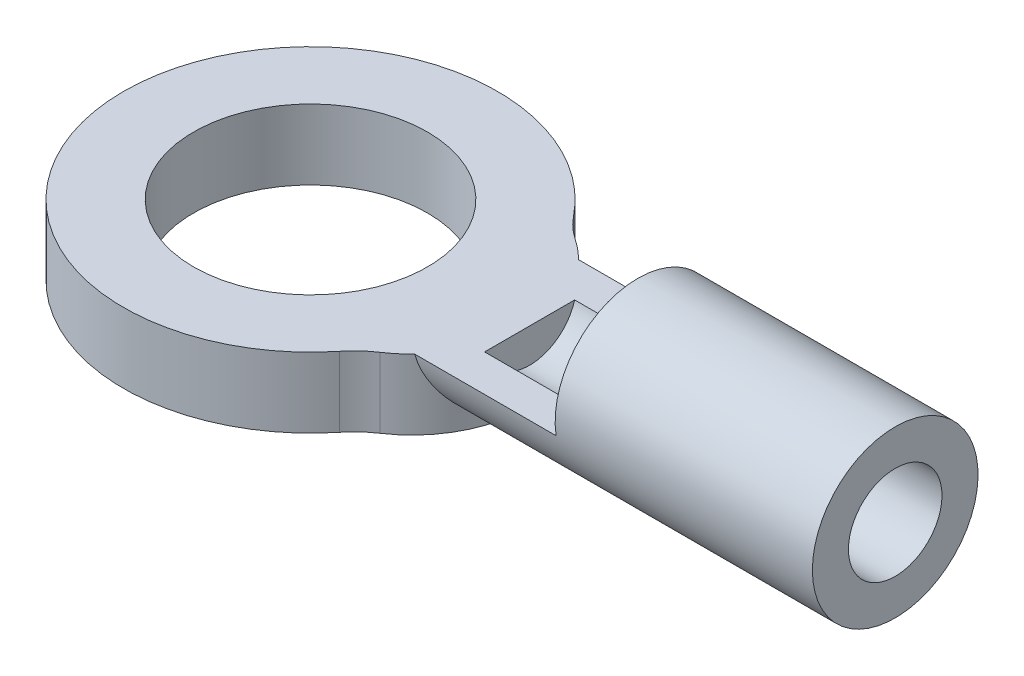
ISO-10303-21;
HEADER;
FILE_DESCRIPTION(('STEP AP214'),'2;1');
FILE_NAME('part.step','',(''),(''),'','','');
FILE_SCHEMA(('AUTOMOTIVE_DESIGN { 1 0 10303 214 1 1 1 1 }'));
ENDSEC;
DATA;
#1=APPLICATION_CONTEXT('core data for automotive mechanical design processes');
#2=APPLICATION_PROTOCOL_DEFINITION('international standard','automotive_design',2000,#1);
#3=PRODUCT_CONTEXT('',#1,'mechanical');
#4=PRODUCT('Part','Part','',(#3));
#5=PRODUCT_RELATED_PRODUCT_CATEGORY('part','',(#4));
#6=PRODUCT_DEFINITION_FORMATION('','',#4);
#7=PRODUCT_DEFINITION_CONTEXT('part definition',#1,'design');
#8=PRODUCT_DEFINITION('design','',#6,#7);
#9=PRODUCT_DEFINITION_SHAPE('','',#8);
#10=(LENGTH_UNIT() NAMED_UNIT(*) SI_UNIT(.MILLI.,.METRE.));
#11=(NAMED_UNIT(*) PLANE_ANGLE_UNIT() SI_UNIT($,.RADIAN.));
#12=(NAMED_UNIT(*) SI_UNIT($,.STERADIAN.) SOLID_ANGLE_UNIT());
#13=UNCERTAINTY_MEASURE_WITH_UNIT(LENGTH_MEASURE(1.E-05),#10,'distance_accuracy_value','');
#14=(GEOMETRIC_REPRESENTATION_CONTEXT(3) GLOBAL_UNCERTAINTY_ASSIGNED_CONTEXT((#13)) GLOBAL_UNIT_ASSIGNED_CONTEXT((#10,
#11,#12)) REPRESENTATION_CONTEXT('',''));
#15=CARTESIAN_POINT('',(0.,0.,0.));
#16=DIRECTION('',(0.,0.,1.));
#17=DIRECTION('',(1.,0.,0.));
#18=AXIS2_PLACEMENT_3D('',#15,#16,#17);
#19=CARTESIAN_POINT('',(4.6837484987988,1.5,3.75));
#20=DIRECTION('',(0.,-1.,0.));
#21=DIRECTION('',(0.,0.,-1.));
#22=AXIS2_PLACEMENT_3D('',#19,#20,#21);
#23=PLANE('',#22);
#24=CARTESIAN_POINT('',(0.,1.5,0.));
#25=DIRECTION('',(0.,1.,0.));
#26=DIRECTION('',(0.,0.,1.));
#27=AXIS2_PLACEMENT_3D('',#24,#25,#26);
#28=CIRCLE('',#27,2.5);
#29=CARTESIAN_POINT('',(0.,1.5,2.5));
#30=VERTEX_POINT('',#29);
#31=EDGE_CURVE('E205',#30,#30,#28,.T.);
#32=ORIENTED_EDGE('',*,*,#31,.F.);
#33=EDGE_LOOP('',(#32));
#34=FACE_BOUND('',#33,.T.);
#35=DIRECTION('',(-1.,0.,0.));
#36=VECTOR('',#35,1.);
#37=CARTESIAN_POINT('',(4.6837484987988,1.5,-1.75));
#38=LINE('',#37,#36);
#39=CARTESIAN_POINT('',(7.,1.5,-1.75));
#40=VERTEX_POINT('',#39);
#41=CARTESIAN_POINT('',(3.9772449574227,1.5,-1.74999999999979));
#42=VERTEX_POINT('',#41);
#43=EDGE_CURVE('E98',#40,#42,#38,.T.);
#44=ORIENTED_EDGE('',*,*,#43,.T.);
#45=CARTESIAN_POINT('',(2.1837484987988,1.5,-0.00834261322605863));
#46=DIRECTION('',(0.,-1.,0.));
#47=DIRECTION('',(0.,0.,-1.));
#48=AXIS2_PLACEMENT_3D('',#45,#46,#47);
#49=CIRCLE('',#48,2.5);
#50=CARTESIAN_POINT('',(3.57263738768769,1.5,-2.0870411614338));
#51=VERTEX_POINT('',#50);
#52=EDGE_CURVE('E249',#42,#51,#49,.F.);
#53=ORIENTED_EDGE('',*,*,#52,.T.);
#54=CARTESIAN_POINT('',(4.6837484987988,1.5,-3.75));
#55=DIRECTION('',(0.,-1.,0.));
#56=DIRECTION('',(0.,0.,1.));
#57=AXIS2_PLACEMENT_3D('',#54,#55,#56);
#58=CIRCLE('',#57,2.);
#59=CARTESIAN_POINT('',(3.1224989991992,1.5,-2.5));
#60=VERTEX_POINT('',#59);
#61=EDGE_CURVE('E212',#51,#60,#58,.T.);
#62=ORIENTED_EDGE('',*,*,#61,.T.);
#63=CARTESIAN_POINT('',(0.,1.5,0.));
#64=DIRECTION('',(0.,1.,0.));
#65=DIRECTION('',(0.,0.,1.));
#66=AXIS2_PLACEMENT_3D('',#63,#64,#65);
#67=CIRCLE('',#66,4.);
#68=CARTESIAN_POINT('',(3.1224989991992,1.5,2.5));
#69=VERTEX_POINT('',#68);
#70=EDGE_CURVE('E215',#60,#69,#67,.T.);
#71=ORIENTED_EDGE('',*,*,#70,.T.);
#72=CARTESIAN_POINT('',(4.6837484987988,1.5,3.75));
#73=DIRECTION('',(0.,-1.,0.));
#74=DIRECTION('',(0.,0.,-1.));
#75=AXIS2_PLACEMENT_3D('',#72,#73,#74);
#76=CIRCLE('',#75,2.);
#77=CARTESIAN_POINT('',(3.57263738768769,1.5,2.0870411614338));
#78=VERTEX_POINT('',#77);
#79=EDGE_CURVE('E217',#69,#78,#76,.T.);
#80=ORIENTED_EDGE('',*,*,#79,.T.);
#81=CARTESIAN_POINT('',(2.1837484987988,1.5,0.00834261322605863));
#82=DIRECTION('',(0.,-1.,0.));
#83=DIRECTION('',(0.,0.,-1.));
#84=AXIS2_PLACEMENT_3D('',#81,#82,#83);
#85=CIRCLE('',#84,2.5);
#86=CARTESIAN_POINT('',(3.9772449574227,1.5,1.74999999999979));
#87=VERTEX_POINT('',#86);
#88=EDGE_CURVE('E246',#78,#87,#85,.F.);
#89=ORIENTED_EDGE('',*,*,#88,.T.);
#90=DIRECTION('',(1.,0.,0.));
#91=VECTOR('',#90,1.);
#92=CARTESIAN_POINT('',(12.5,1.5,1.75));
#93=LINE('',#92,#91);
#94=CARTESIAN_POINT('',(7.,1.5,1.75));
#95=VERTEX_POINT('',#94);
#96=EDGE_CURVE('E220',#87,#95,#93,.T.);
#97=ORIENTED_EDGE('',*,*,#96,.T.);
#98=DIRECTION('',(0.,0.,-1.));
#99=VECTOR('',#98,1.);
#100=CARTESIAN_POINT('',(7.,1.5,3.75));
#101=LINE('',#100,#99);
#102=CARTESIAN_POINT('',(7.,1.5,0.96262625434566));
#103=VERTEX_POINT('',#102);
#104=EDGE_CURVE('E201',#95,#103,#101,.T.);
#105=ORIENTED_EDGE('',*,*,#104,.T.);
#106=DIRECTION('',(1.,0.,0.));
#107=VECTOR('',#106,1.);
#108=CARTESIAN_POINT('',(4.6837484987988,1.5,0.96262625434566));
#109=LINE('',#108,#107);
#110=CARTESIAN_POINT('',(4.6837484987988,1.5,0.96262625434566));
#111=VERTEX_POINT('',#110);
#112=EDGE_CURVE('E189',#111,#103,#109,.T.);
#113=ORIENTED_EDGE('',*,*,#112,.F.);
#114=DIRECTION('',(0.,0.,-1.));
#115=VECTOR('',#114,1.);
#116=CARTESIAN_POINT('',(4.6837484987988,1.5,3.75));
#117=LINE('',#116,#115);
#118=CARTESIAN_POINT('',(4.6837484987988,1.5,-0.962626254345661));
#119=VERTEX_POINT('',#118);
#120=EDGE_CURVE('E236',#111,#119,#117,.T.);
#121=ORIENTED_EDGE('',*,*,#120,.T.);
#122=DIRECTION('',(1.,0.,0.));
#123=VECTOR('',#122,1.);
#124=CARTESIAN_POINT('',(4.6837484987988,1.5,-0.962626254345661));
#125=LINE('',#124,#123);
#126=CARTESIAN_POINT('',(7.,1.5,-0.962626254345661));
#127=VERTEX_POINT('',#126);
#128=EDGE_CURVE('E192',#127,#119,#125,.F.);
#129=ORIENTED_EDGE('',*,*,#128,.F.);
#130=EDGE_CURVE('E198',#127,#40,#101,.T.);
#131=ORIENTED_EDGE('',*,*,#130,.T.);
#132=EDGE_LOOP('',(#44,#53,#62,#71,#80,#89,#97,#105,#113,#121,#129,#131));
#133=FACE_BOUND('',#132,.T.);
#134=ADVANCED_FACE('F72',(#34,#133),#23,.F.);
#135=CARTESIAN_POINT('',(4.6837484987988,0.,3.75));
#136=DIRECTION('',(0.,-1.,0.));
#137=DIRECTION('',(0.,0.,-1.));
#138=AXIS2_PLACEMENT_3D('',#135,#136,#137);
#139=PLANE('',#138);
#140=CARTESIAN_POINT('',(4.6837484987988,0.,-3.75));
#141=DIRECTION('',(0.,-1.,0.));
#142=DIRECTION('',(0.,0.,1.));
#143=AXIS2_PLACEMENT_3D('',#140,#141,#142);
#144=CIRCLE('',#143,2.);
#145=CARTESIAN_POINT('',(3.57263738768769,0.,-2.0870411614338));
#146=VERTEX_POINT('',#145);
#147=CARTESIAN_POINT('',(3.1224989991992,0.,-2.5));
#148=VERTEX_POINT('',#147);
#149=EDGE_CURVE('E208',#146,#148,#144,.T.);
#150=ORIENTED_EDGE('',*,*,#149,.F.);
#151=CARTESIAN_POINT('',(2.1837484987988,0.,-0.00834261322605863));
#152=DIRECTION('',(0.,-1.,0.));
#153=DIRECTION('',(0.,0.,-1.));
#154=AXIS2_PLACEMENT_3D('',#151,#152,#153);
#155=CIRCLE('',#154,2.5);
#156=CARTESIAN_POINT('',(4.6837484987988,0.,-0.00834261322605863));
#157=VERTEX_POINT('',#156);
#158=EDGE_CURVE('E178',#146,#157,#155,.T.);
#159=ORIENTED_EDGE('',*,*,#158,.T.);
#160=DIRECTION('',(0.,0.,-1.));
#161=VECTOR('',#160,1.);
#162=CARTESIAN_POINT('',(4.6837484987988,0.,-1.75));
#163=LINE('',#162,#161);
#164=CARTESIAN_POINT('',(4.6837484987988,0.,0.));
#165=VERTEX_POINT('',#164);
#166=EDGE_CURVE('E160',#165,#157,#163,.T.);
#167=ORIENTED_EDGE('',*,*,#166,.F.);
#168=DIRECTION('',(0.,0.,-1.));
#169=VECTOR('',#168,1.);
#170=CARTESIAN_POINT('',(4.6837484987988,0.,-1.75));
#171=LINE('',#170,#169);
#172=CARTESIAN_POINT('',(4.6837484987988,0.,0.00834261322605863));
#173=VERTEX_POINT('',#172);
#174=EDGE_CURVE('E168',#173,#165,#171,.T.);
#175=ORIENTED_EDGE('',*,*,#174,.F.);
#176=CARTESIAN_POINT('',(2.1837484987988,0.,0.00834261322605863));
#177=DIRECTION('',(0.,-1.,0.));
#178=DIRECTION('',(0.,0.,-1.));
#179=AXIS2_PLACEMENT_3D('',#176,#177,#178);
#180=CIRCLE('',#179,2.5);
#181=CARTESIAN_POINT('',(3.57263738768769,0.,2.0870411614338));
#182=VERTEX_POINT('',#181);
#183=EDGE_CURVE('E242',#173,#182,#180,.T.);
#184=ORIENTED_EDGE('',*,*,#183,.T.);
#185=CARTESIAN_POINT('',(4.6837484987988,0.,3.75));
#186=DIRECTION('',(0.,-1.,0.));
#187=DIRECTION('',(0.,0.,-1.));
#188=AXIS2_PLACEMENT_3D('',#185,#186,#187);
#189=CIRCLE('',#188,2.);
#190=CARTESIAN_POINT('',(3.1224989991992,0.,2.5));
#191=VERTEX_POINT('',#190);
#192=EDGE_CURVE('E213',#191,#182,#189,.T.);
#193=ORIENTED_EDGE('',*,*,#192,.F.);
#194=CARTESIAN_POINT('',(0.,0.,0.));
#195=DIRECTION('',(0.,1.,0.));
#196=DIRECTION('',(0.,0.,1.));
#197=AXIS2_PLACEMENT_3D('',#194,#195,#196);
#198=CIRCLE('',#197,4.);
#199=EDGE_CURVE('E224',#148,#191,#198,.T.);
#200=ORIENTED_EDGE('',*,*,#199,.F.);
#201=EDGE_LOOP('',(#150,#159,#167,#175,#184,#193,#200));
#202=FACE_BOUND('',#201,.T.);
#203=CARTESIAN_POINT('',(0.,0.,0.));
#204=DIRECTION('',(0.,1.,0.));
#205=DIRECTION('',(0.,0.,1.));
#206=AXIS2_PLACEMENT_3D('',#203,#204,#205);
#207=CIRCLE('',#206,2.5);
#208=CARTESIAN_POINT('',(0.,0.,2.5));
#209=VERTEX_POINT('',#208);
#210=EDGE_CURVE('E204',#209,#209,#207,.T.);
#211=ORIENTED_EDGE('',*,*,#210,.T.);
#212=EDGE_LOOP('',(#211));
#213=FACE_BOUND('',#212,.T.);
#214=ADVANCED_FACE('F176',(#202,#213),#139,.T.);
#215=CARTESIAN_POINT('',(12.5,1.5,-1.75));
#216=DIRECTION('',(-1.,0.,0.));
#217=DIRECTION('',(0.,0.,1.));
#218=AXIS2_PLACEMENT_3D('',#215,#216,#217);
#219=PLANE('',#218);
#220=CARTESIAN_POINT('',(12.5,1.77083333333333,0.));
#221=DIRECTION('',(-1.,0.,0.));
#222=DIRECTION('',(0.,0.,1.));
#223=AXIS2_PLACEMENT_3D('',#220,#221,#222);
#224=CIRCLE('',#223,1.);
#225=CARTESIAN_POINT('',(12.5,1.77083333333333,1.));
#226=VERTEX_POINT('',#225);
#227=EDGE_CURVE('E182',#226,#226,#224,.T.);
#228=ORIENTED_EDGE('',*,*,#227,.T.);
#229=EDGE_LOOP('',(#228));
#230=FACE_BOUND('',#229,.T.);
#231=CARTESIAN_POINT('',(12.5,1.77083333333333,0.));
#232=DIRECTION('',(-1.,0.,0.));
#233=DIRECTION('',(0.,0.,1.));
#234=AXIS2_PLACEMENT_3D('',#231,#232,#233);
#235=CIRCLE('',#234,1.77083333333333);
#236=CARTESIAN_POINT('',(12.5,1.77083333333333,1.77083333333333));
#237=VERTEX_POINT('',#236);
#238=EDGE_CURVE('E194',#237,#237,#235,.T.);
#239=ORIENTED_EDGE('',*,*,#238,.F.);
#240=EDGE_LOOP('',(#239));
#241=FACE_BOUND('',#240,.T.);
#242=ADVANCED_FACE('F264',(#230,#241),#219,.F.);
#243=CARTESIAN_POINT('',(4.6837484987988,1.5,-3.75));
#244=DIRECTION('',(0.,-1.,0.));
#245=DIRECTION('',(0.,0.,-1.));
#246=AXIS2_PLACEMENT_3D('',#243,#244,#245);
#247=CYLINDRICAL_SURFACE('',#246,2.);
#248=ORIENTED_EDGE('',*,*,#61,.F.);
#249=DIRECTION('',(0.,-1.,0.));
#250=VECTOR('',#249,1.);
#251=CARTESIAN_POINT('',(3.57263738768769,1.5,-2.0870411614338));
#252=LINE('',#251,#250);
#253=EDGE_CURVE('E239',#51,#146,#252,.T.);
#254=ORIENTED_EDGE('',*,*,#253,.T.);
#255=ORIENTED_EDGE('',*,*,#149,.T.);
#256=DIRECTION('',(0.,-1.,0.));
#257=VECTOR('',#256,1.);
#258=CARTESIAN_POINT('',(3.1224989991992,1.5,-2.5));
#259=LINE('',#258,#257);
#260=EDGE_CURVE('E230',#60,#148,#259,.T.);
#261=ORIENTED_EDGE('',*,*,#260,.F.);
#262=EDGE_LOOP('',(#248,#254,#255,#261));
#263=FACE_BOUND('',#262,.T.);
#264=ADVANCED_FACE('F267',(#263),#247,.F.);
#265=CARTESIAN_POINT('',(0.,1.5,0.));
#266=DIRECTION('',(0.,-1.,0.));
#267=DIRECTION('',(0.,0.,-1.));
#268=AXIS2_PLACEMENT_3D('',#265,#266,#267);
#269=CYLINDRICAL_SURFACE('',#268,4.);
#270=ORIENTED_EDGE('',*,*,#199,.T.);
#271=DIRECTION('',(0.,-1.,0.));
#272=VECTOR('',#271,1.);
#273=CARTESIAN_POINT('',(3.1224989991992,1.5,2.5));
#274=LINE('',#273,#272);
#275=EDGE_CURVE('E222',#69,#191,#274,.T.);
#276=ORIENTED_EDGE('',*,*,#275,.F.);
#277=ORIENTED_EDGE('',*,*,#70,.F.);
#278=ORIENTED_EDGE('',*,*,#260,.T.);
#279=EDGE_LOOP('',(#270,#276,#277,#278));
#280=FACE_BOUND('',#279,.T.);
#281=ADVANCED_FACE('F271',(#280),#269,.T.);
#282=CARTESIAN_POINT('',(4.6837484987988,1.5,3.75));
#283=DIRECTION('',(0.,-1.,0.));
#284=DIRECTION('',(0.,0.,-1.));
#285=AXIS2_PLACEMENT_3D('',#282,#283,#284);
#286=CYLINDRICAL_SURFACE('',#285,2.);
#287=ORIENTED_EDGE('',*,*,#192,.T.);
#288=DIRECTION('',(0.,-1.,0.));
#289=VECTOR('',#288,1.);
#290=CARTESIAN_POINT('',(3.57263738768769,1.5,2.0870411614338));
#291=LINE('',#290,#289);
#292=EDGE_CURVE('E252',#182,#78,#291,.F.);
#293=ORIENTED_EDGE('',*,*,#292,.T.);
#294=ORIENTED_EDGE('',*,*,#79,.F.);
#295=ORIENTED_EDGE('',*,*,#275,.T.);
#296=EDGE_LOOP('',(#287,#293,#294,#295));
#297=FACE_BOUND('',#296,.T.);
#298=ADVANCED_FACE('F275',(#297),#286,.F.);
#299=CARTESIAN_POINT('',(0.,1.5,0.));
#300=DIRECTION('',(0.,-1.,0.));
#301=DIRECTION('',(0.,0.,-1.));
#302=AXIS2_PLACEMENT_3D('',#299,#300,#301);
#303=CYLINDRICAL_SURFACE('',#302,2.5);
#304=ORIENTED_EDGE('',*,*,#31,.T.);
#305=EDGE_LOOP('',(#304));
#306=FACE_BOUND('',#305,.T.);
#307=ORIENTED_EDGE('',*,*,#210,.F.);
#308=EDGE_LOOP('',(#307));
#309=FACE_BOUND('',#308,.T.);
#310=ADVANCED_FACE('F279',(#306,#309),#303,.F.);
#311=CARTESIAN_POINT('',(7.,1.77083333333333,0.));
#312=DIRECTION('',(1.,0.,0.));
#313=DIRECTION('',(0.,0.,-1.));
#314=AXIS2_PLACEMENT_3D('',#311,#312,#313);
#315=CYLINDRICAL_SURFACE('',#314,1.77083333333333);
#316=ORIENTED_EDGE('',*,*,#43,.F.);
#317=CARTESIAN_POINT('',(7.,1.77083333333333,0.));
#318=DIRECTION('',(-1.,0.,0.));
#319=DIRECTION('',(0.,0.,1.));
#320=AXIS2_PLACEMENT_3D('',#317,#318,#319);
#321=CIRCLE('',#320,1.77083333333333);
#322=EDGE_CURVE('E195',#95,#40,#321,.T.);
#323=ORIENTED_EDGE('',*,*,#322,.F.);
#324=ORIENTED_EDGE('',*,*,#96,.F.);
#325=CARTESIAN_POINT('',(3.97724495742291,1.5,1.75));
#326=CARTESIAN_POINT('',(3.99158225029149,1.40440247209379,1.73519095208426));
#327=CARTESIAN_POINT('',(4.01299826499508,1.3117470490429,1.71285618178779));
#328=CARTESIAN_POINT('',(4.06518068253529,1.13426773383578,1.65507350784467));
#329=CARTESIAN_POINT('',(4.09586455448706,1.04938300113311,1.61974077008595));
#330=CARTESIAN_POINT('',(4.16192785537648,0.888317469168398,1.53790001874279));
#331=CARTESIAN_POINT('',(4.19726948277635,0.812074930894624,1.49147975618988));
#332=CARTESIAN_POINT('',(4.26953384553164,0.667577329760527,1.38801662214952));
#333=CARTESIAN_POINT('',(4.3064615588735,0.599350374015784,1.33093808761423));
#334=CARTESIAN_POINT('',(4.38575587619727,0.459839522073387,1.19512445835969));
#335=CARTESIAN_POINT('',(4.42784565831359,0.390376695997226,1.11433547676595));
#336=CARTESIAN_POINT('',(4.50577100770922,0.266053765823562,0.939639938616452));
#337=CARTESIAN_POINT('',(4.54161836273597,0.211166033946456,0.845758721979486));
#338=CARTESIAN_POINT('',(4.59584603723531,0.129602130890404,0.670260408595004));
#339=CARTESIAN_POINT('',(4.61635184814466,0.0993257848714841,0.590967770563231));
#340=CARTESIAN_POINT('',(4.64977184507535,0.0502560101486095,0.427444306051615));
#341=CARTESIAN_POINT('',(4.66270198797801,0.0314384421245151,0.343224273138863));
#342=CARTESIAN_POINT('',(4.67540670635096,0.0127991932968544,0.21657956910875));
#343=CARTESIAN_POINT('',(4.6785262477233,0.00818715769142653,0.175130758997636));
#344=CARTESIAN_POINT('',(4.68269891341957,0.00189476565126467,0.091912268933684));
#345=CARTESIAN_POINT('',(4.68375222841558,0.000214138706713578,0.0501426189452168));
#346=CARTESIAN_POINT('',(4.68374849879894,1.9651646389794E-05,0.00834261322610013));
#347=B_SPLINE_CURVE_WITH_KNOTS('',3,(#325,#326,#327,#328,#329,#330,#331,#332,#333,#334,#335,
#336,#337,#338,#339,#340,#341,#342,#343,#344,#345,#346),.UNSPECIFIED.,.F.,.F.,(4,2,2,2,2,2,2,2,
2,2,4),(0.,0.291812855652783,0.581100100374919,0.868169546905184,1.15621733566415,
1.49821833719223,1.83956635563192,2.10046303524391,2.36080818529953,2.48613663742352,
2.6114535236505),.UNSPECIFIED.);
#348=CARTESIAN_POINT('',(4.6837484987988,1.96516465771675E-05,0.00834261322605863));
#349=VERTEX_POINT('',#348);
#350=EDGE_CURVE('E12',#87,#349,#347,.T.);
#351=ORIENTED_EDGE('',*,*,#350,.T.);
#352=CARTESIAN_POINT('',(4.6837484987988,1.77083333333333,0.));
#353=DIRECTION('',(-1.,0.,0.));
#354=DIRECTION('',(0.,0.,1.));
#355=AXIS2_PLACEMENT_3D('',#352,#353,#354);
#356=CIRCLE('',#355,1.77083333333333);
#357=EDGE_CURVE('E170',#165,#349,#356,.T.);
#358=ORIENTED_EDGE('',*,*,#357,.F.);
#359=CARTESIAN_POINT('',(4.6837484987988,1.77083333333333,0.));
#360=DIRECTION('',(-1.,0.,0.));
#361=DIRECTION('',(0.,0.,1.));
#362=AXIS2_PLACEMENT_3D('',#359,#360,#361);
#363=CIRCLE('',#362,1.77083333333333);
#364=CARTESIAN_POINT('',(4.6837484987988,1.96516465771675E-05,-0.00834261322605863));
#365=VERTEX_POINT('',#364);
#366=EDGE_CURVE('E156',#365,#165,#363,.T.);
#367=ORIENTED_EDGE('',*,*,#366,.F.);
#368=CARTESIAN_POINT('',(4.6837484987988,1.96516465771675E-05,-0.00834261322605863));
#369=CARTESIAN_POINT('',(4.68375823963201,0.0002184861349022,-0.0524560987528245));
#370=CARTESIAN_POINT('',(4.68258119743062,0.00208335814662257,-0.0965547495052129));
#371=CARTESIAN_POINT('',(4.67793000948205,0.00907366772005536,-0.184344636514679));
#372=CARTESIAN_POINT('',(4.67445726787937,0.0141971121318563,-0.228036105265948));
#373=CARTESIAN_POINT('',(4.66532011032616,0.0275907575511066,-0.314413191988465));
#374=CARTESIAN_POINT('',(4.65966976908736,0.0358407448525039,-0.357103438900114));
#375=CARTESIAN_POINT('',(4.64631680225524,0.0553604033522117,-0.441451809178473));
#376=CARTESIAN_POINT('',(4.63861396075981,0.0666303922246312,-0.483109823460675));
#377=CARTESIAN_POINT('',(4.61270728069508,0.104699492809302,-0.605945435844257));
#378=CARTESIAN_POINT('',(4.59167617331936,0.135799344198038,-0.685245544304424));
#379=CARTESIAN_POINT('',(4.54371413516518,0.208104912060897,-0.83715992260753));
#380=CARTESIAN_POINT('',(4.5167760939386,0.249322815306013,-0.909765983597433));
#381=CARTESIAN_POINT('',(4.45624431289233,0.344629025578171,-1.05350520479072));
#382=CARTESIAN_POINT('',(4.4222718738014,0.399535474732446,-1.12393433720358));
#383=CARTESIAN_POINT('',(4.35187274511075,0.518616452550315,-1.2552615864841));
#384=CARTESIAN_POINT('',(4.31544136083182,0.582808993669713,-1.31614068921876));
#385=CARTESIAN_POINT('',(4.23623396415136,0.731920784928078,-1.43784075166779));
#386=CARTESIAN_POINT('',(4.19349712257121,0.818490712559116,-1.49667607937963));
#387=CARTESIAN_POINT('',(4.11363610767568,1.00238658108373,-1.59885088758446));
#388=CARTESIAN_POINT('',(4.07648838075896,1.09966421117206,-1.64225651069823));
#389=CARTESIAN_POINT('',(4.03093262994019,1.24947525220813,-1.69309642461461));
#390=CARTESIAN_POINT('',(4.01775011997794,1.29827339770464,-1.70738136441856));
#391=CARTESIAN_POINT('',(3.99476044376174,1.39779512551135,-1.7318578837988));
#392=CARTESIAN_POINT('',(3.98496248803659,1.4485235512448,-1.74203830595488));
#393=CARTESIAN_POINT('',(3.97724495742252,1.49999999999989,-1.74999999999998));
#394=B_SPLINE_CURVE_WITH_KNOTS('',3,(#368,#369,#370,#371,#372,#373,#374,#375,#376,#377,#378,
#379,#380,#381,#382,#383,#384,#385,#386,#387,#388,#389,#390,#391,#392,#393),.UNSPECIFIED.,.F.,
.F.,(4,2,2,2,2,2,2,2,2,2,2,2,4),(0.,0.132283571995284,0.264486308666888,0.395848520233118,
0.527224555224535,0.789189395073268,1.05147132226462,1.33705672307936,1.62320369942418,
1.96089206122864,2.29711488162605,2.45442547896835,2.61216086057927),.UNSPECIFIED.);
#395=EDGE_CURVE('E85',#365,#42,#394,.T.);
#396=ORIENTED_EDGE('',*,*,#395,.T.);
#397=EDGE_LOOP('',(#316,#323,#324,#351,#358,#367,#396));
#398=FACE_BOUND('',#397,.T.);
#399=ORIENTED_EDGE('',*,*,#238,.T.);
#400=EDGE_LOOP('',(#399));
#401=FACE_BOUND('',#400,.T.);
#402=ADVANCED_FACE('F180',(#398,#401),#315,.T.);
#403=CARTESIAN_POINT('',(7.,1.77083333333333,0.));
#404=DIRECTION('',(-1.,0.,0.));
#405=DIRECTION('',(0.,0.,1.));
#406=AXIS2_PLACEMENT_3D('',#403,#404,#405);
#407=PLANE('',#406);
#408=ORIENTED_EDGE('',*,*,#130,.F.);
#409=CARTESIAN_POINT('',(7.,1.77083333333333,0.));
#410=DIRECTION('',(-1.,0.,0.));
#411=DIRECTION('',(0.,0.,1.));
#412=AXIS2_PLACEMENT_3D('',#409,#410,#411);
#413=CIRCLE('',#412,1.);
#414=EDGE_CURVE('E233',#127,#103,#413,.F.);
#415=ORIENTED_EDGE('',*,*,#414,.T.);
#416=ORIENTED_EDGE('',*,*,#104,.F.);
#417=ORIENTED_EDGE('',*,*,#322,.T.);
#418=EDGE_LOOP('',(#408,#415,#416,#417));
#419=FACE_BOUND('',#418,.T.);
#420=ADVANCED_FACE('F290',(#419),#407,.T.);
#421=CARTESIAN_POINT('',(4.6837484987988,1.77083333333333,0.));
#422=DIRECTION('',(-1.,0.,0.));
#423=DIRECTION('',(0.,0.,1.));
#424=AXIS2_PLACEMENT_3D('',#421,#422,#423);
#425=PLANE('',#424);
#426=CARTESIAN_POINT('',(4.6837484987988,1.77083333333333,0.));
#427=DIRECTION('',(-1.,0.,0.));
#428=DIRECTION('',(0.,0.,1.));
#429=AXIS2_PLACEMENT_3D('',#426,#427,#428);
#430=CIRCLE('',#429,1.);
#431=EDGE_CURVE('E185',#119,#111,#430,.T.);
#432=ORIENTED_EDGE('',*,*,#431,.F.);
#433=ORIENTED_EDGE('',*,*,#120,.F.);
#434=EDGE_LOOP('',(#432,#433));
#435=FACE_BOUND('',#434,.T.);
#436=ADVANCED_FACE('F297',(#435),#425,.F.);
#437=CARTESIAN_POINT('',(4.6837484987988,1.77083333333333,0.));
#438=DIRECTION('',(1.,0.,0.));
#439=DIRECTION('',(0.,0.,-1.));
#440=AXIS2_PLACEMENT_3D('',#437,#438,#439);
#441=CYLINDRICAL_SURFACE('',#440,1.);
#442=ORIENTED_EDGE('',*,*,#227,.F.);
#443=EDGE_LOOP('',(#442));
#444=FACE_BOUND('',#443,.T.);
#445=ORIENTED_EDGE('',*,*,#128,.T.);
#446=ORIENTED_EDGE('',*,*,#431,.T.);
#447=ORIENTED_EDGE('',*,*,#112,.T.);
#448=ORIENTED_EDGE('',*,*,#414,.F.);
#449=EDGE_LOOP('',(#445,#446,#447,#448));
#450=FACE_BOUND('',#449,.T.);
#451=ADVANCED_FACE('F302',(#444,#450),#441,.F.);
#452=CARTESIAN_POINT('',(4.6837484987988,1.77083333333333,0.));
#453=DIRECTION('',(-1.,0.,0.));
#454=DIRECTION('',(0.,0.,1.));
#455=AXIS2_PLACEMENT_3D('',#452,#453,#454);
#456=PLANE('',#455);
#457=ORIENTED_EDGE('',*,*,#357,.T.);
#458=DIRECTION('',(0.,-1.,0.));
#459=VECTOR('',#458,1.);
#460=CARTESIAN_POINT('',(4.6837484987988,1.77083333333333,0.00834261322605863));
#461=LINE('',#460,#459);
#462=EDGE_CURVE('E172',#349,#173,#461,.T.);
#463=ORIENTED_EDGE('',*,*,#462,.T.);
#464=ORIENTED_EDGE('',*,*,#174,.T.);
#465=EDGE_LOOP('',(#457,#463,#464));
#466=FACE_BOUND('',#465,.T.);
#467=ADVANCED_FACE('F169',(#466),#456,.F.);
#468=CARTESIAN_POINT('',(4.6837484987988,1.77083333333333,0.));
#469=DIRECTION('',(-1.,0.,0.));
#470=DIRECTION('',(0.,0.,1.));
#471=AXIS2_PLACEMENT_3D('',#468,#469,#470);
#472=PLANE('',#471);
#473=ORIENTED_EDGE('',*,*,#166,.T.);
#474=DIRECTION('',(0.,-1.,0.));
#475=VECTOR('',#474,1.);
#476=CARTESIAN_POINT('',(4.6837484987988,1.77083333333333,-0.00834261322605863));
#477=LINE('',#476,#475);
#478=EDGE_CURVE('E162',#157,#365,#477,.F.);
#479=ORIENTED_EDGE('',*,*,#478,.T.);
#480=ORIENTED_EDGE('',*,*,#366,.T.);
#481=EDGE_LOOP('',(#473,#479,#480));
#482=FACE_BOUND('',#481,.T.);
#483=ADVANCED_FACE('F158',(#482),#472,.F.);
#484=CARTESIAN_POINT('',(2.1837484987988,1.5,-0.00834261322605863));
#485=DIRECTION('',(0.,-1.,0.));
#486=DIRECTION('',(0.,0.,-1.));
#487=AXIS2_PLACEMENT_3D('',#484,#485,#486);
#488=CYLINDRICAL_SURFACE('',#487,2.5);
#489=ORIENTED_EDGE('',*,*,#395,.F.);
#490=ORIENTED_EDGE('',*,*,#478,.F.);
#491=ORIENTED_EDGE('',*,*,#158,.F.);
#492=ORIENTED_EDGE('',*,*,#253,.F.);
#493=ORIENTED_EDGE('',*,*,#52,.F.);
#494=EDGE_LOOP('',(#489,#490,#491,#492,#493));
#495=FACE_BOUND('',#494,.T.);
#496=ADVANCED_FACE('F259',(#495),#488,.T.);
#497=CARTESIAN_POINT('',(2.1837484987988,1.5,0.00834261322605863));
#498=DIRECTION('',(0.,-1.,0.));
#499=DIRECTION('',(0.,0.,-1.));
#500=AXIS2_PLACEMENT_3D('',#497,#498,#499);
#501=CYLINDRICAL_SURFACE('',#500,2.5);
#502=ORIENTED_EDGE('',*,*,#88,.F.);
#503=ORIENTED_EDGE('',*,*,#292,.F.);
#504=ORIENTED_EDGE('',*,*,#183,.F.);
#505=ORIENTED_EDGE('',*,*,#462,.F.);
#506=ORIENTED_EDGE('',*,*,#350,.F.);
#507=EDGE_LOOP('',(#502,#503,#504,#505,#506));
#508=FACE_BOUND('',#507,.T.);
#509=ADVANCED_FACE('F74',(#508),#501,.T.);
#510=CLOSED_SHELL('',(#134,#214,#242,#264,#281,#298,#310,#402,#420,#436,#451,#467,#483,#496,#509));
#511=MANIFOLD_SOLID_BREP('B2',#510);
#512=ADVANCED_BREP_SHAPE_REPRESENTATION('',(#18,#511),#14);
#513=SHAPE_DEFINITION_REPRESENTATION(#9,#512);
ENDSEC;
END-ISO-10303-21;
